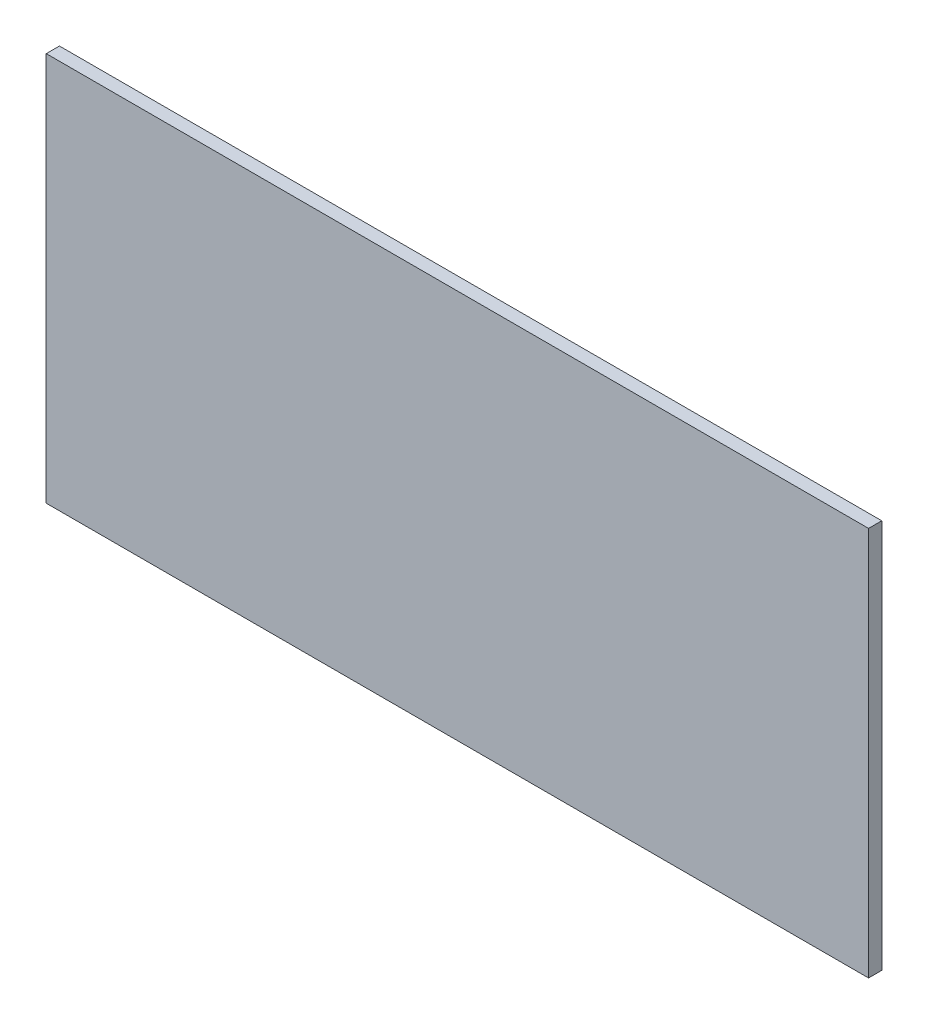
ISO-10303-21;
HEADER;
FILE_DESCRIPTION(('STEP AP214'),'2;1');
FILE_NAME('part.step','',(''),(''),'','','');
FILE_SCHEMA(('AUTOMOTIVE_DESIGN { 1 0 10303 214 1 1 1 1 }'));
ENDSEC;
DATA;
#1=APPLICATION_CONTEXT('core data for automotive mechanical design processes');
#2=APPLICATION_PROTOCOL_DEFINITION('international standard','automotive_design',2000,#1);
#3=PRODUCT_CONTEXT('',#1,'mechanical');
#4=PRODUCT('Part','Part','',(#3));
#5=PRODUCT_RELATED_PRODUCT_CATEGORY('part','',(#4));
#6=PRODUCT_DEFINITION_FORMATION('','',#4);
#7=PRODUCT_DEFINITION_CONTEXT('part definition',#1,'design');
#8=PRODUCT_DEFINITION('design','',#6,#7);
#9=PRODUCT_DEFINITION_SHAPE('','',#8);
#10=(LENGTH_UNIT() NAMED_UNIT(*) SI_UNIT(.MILLI.,.METRE.));
#11=(NAMED_UNIT(*) PLANE_ANGLE_UNIT() SI_UNIT($,.RADIAN.));
#12=(NAMED_UNIT(*) SI_UNIT($,.STERADIAN.) SOLID_ANGLE_UNIT());
#13=UNCERTAINTY_MEASURE_WITH_UNIT(LENGTH_MEASURE(1.E-05),#10,'distance_accuracy_value','');
#14=(GEOMETRIC_REPRESENTATION_CONTEXT(3) GLOBAL_UNCERTAINTY_ASSIGNED_CONTEXT((#13)) GLOBAL_UNIT_ASSIGNED_CONTEXT((#10,
#11,#12)) REPRESENTATION_CONTEXT('',''));
#15=CARTESIAN_POINT('',(0.,0.,0.));
#16=DIRECTION('',(0.,0.,1.));
#17=DIRECTION('',(1.,0.,0.));
#18=AXIS2_PLACEMENT_3D('',#15,#16,#17);
#19=CARTESIAN_POINT('',(-34.05,-14.75,1.));
#20=DIRECTION('',(1.,0.,0.));
#21=DIRECTION('',(0.,0.,-1.));
#22=AXIS2_PLACEMENT_3D('',#19,#20,#21);
#23=PLANE('',#22);
#24=DIRECTION('',(0.,-1.,0.));
#25=VECTOR('',#24,1.);
#26=CARTESIAN_POINT('',(-34.05,-14.75,0.));
#27=LINE('',#26,#25);
#28=CARTESIAN_POINT('',(-34.05,14.75,0.));
#29=VERTEX_POINT('',#28);
#30=CARTESIAN_POINT('',(-34.05,-14.75,0.));
#31=VERTEX_POINT('',#30);
#32=EDGE_CURVE('E98',#29,#31,#27,.T.);
#33=ORIENTED_EDGE('',*,*,#32,.T.);
#34=DIRECTION('',(0.,0.,-1.));
#35=VECTOR('',#34,1.);
#36=CARTESIAN_POINT('',(-34.05,-14.75,1.));
#37=LINE('',#36,#35);
#38=CARTESIAN_POINT('',(-34.05,-14.75,1.));
#39=VERTEX_POINT('',#38);
#40=EDGE_CURVE('E11',#39,#31,#37,.T.);
#41=ORIENTED_EDGE('',*,*,#40,.F.);
#42=DIRECTION('',(0.,-1.,0.));
#43=VECTOR('',#42,1.);
#44=CARTESIAN_POINT('',(-34.05,-14.75,1.));
#45=LINE('',#44,#43);
#46=CARTESIAN_POINT('',(-34.05,14.75,1.));
#47=VERTEX_POINT('',#46);
#48=EDGE_CURVE('E86',#47,#39,#45,.T.);
#49=ORIENTED_EDGE('',*,*,#48,.F.);
#50=DIRECTION('',(0.,0.,-1.));
#51=VECTOR('',#50,1.);
#52=CARTESIAN_POINT('',(-34.05,14.75,1.));
#53=LINE('',#52,#51);
#54=EDGE_CURVE('E94',#47,#29,#53,.T.);
#55=ORIENTED_EDGE('',*,*,#54,.T.);
#56=EDGE_LOOP('',(#33,#41,#49,#55));
#57=FACE_BOUND('',#56,.T.);
#58=ADVANCED_FACE('F35',(#57),#23,.F.);
#59=CARTESIAN_POINT('',(28.25,-14.75,1.));
#60=DIRECTION('',(0.,1.,0.));
#61=DIRECTION('',(-1.,0.,0.));
#62=AXIS2_PLACEMENT_3D('',#59,#60,#61);
#63=PLANE('',#62);
#64=DIRECTION('',(1.,0.,0.));
#65=VECTOR('',#64,1.);
#66=CARTESIAN_POINT('',(28.25,-14.75,0.));
#67=LINE('',#66,#65);
#68=CARTESIAN_POINT('',(28.25,-14.75,0.));
#69=VERTEX_POINT('',#68);
#70=EDGE_CURVE('E90',#31,#69,#67,.T.);
#71=ORIENTED_EDGE('',*,*,#70,.T.);
#72=DIRECTION('',(0.,0.,-1.));
#73=VECTOR('',#72,1.);
#74=CARTESIAN_POINT('',(28.25,-14.75,1.));
#75=LINE('',#74,#73);
#76=CARTESIAN_POINT('',(28.25,-14.75,1.));
#77=VERTEX_POINT('',#76);
#78=EDGE_CURVE('E43',#77,#69,#75,.T.);
#79=ORIENTED_EDGE('',*,*,#78,.F.);
#80=DIRECTION('',(1.,0.,0.));
#81=VECTOR('',#80,1.);
#82=CARTESIAN_POINT('',(28.25,-14.75,1.));
#83=LINE('',#82,#81);
#84=EDGE_CURVE('E81',#39,#77,#83,.T.);
#85=ORIENTED_EDGE('',*,*,#84,.F.);
#86=ORIENTED_EDGE('',*,*,#40,.T.);
#87=EDGE_LOOP('',(#71,#79,#85,#86));
#88=FACE_BOUND('',#87,.T.);
#89=ADVANCED_FACE('F89',(#88),#63,.F.);
#90=CARTESIAN_POINT('',(28.25,-14.75,1.));
#91=DIRECTION('',(-1.,0.,0.));
#92=DIRECTION('',(0.,0.,1.));
#93=AXIS2_PLACEMENT_3D('',#90,#91,#92);
#94=PLANE('',#93);
#95=DIRECTION('',(0.,1.,0.));
#96=VECTOR('',#95,1.);
#97=CARTESIAN_POINT('',(28.25,-14.75,0.));
#98=LINE('',#97,#96);
#99=CARTESIAN_POINT('',(28.25,14.75,0.));
#100=VERTEX_POINT('',#99);
#101=EDGE_CURVE('E68',#69,#100,#98,.T.);
#102=ORIENTED_EDGE('',*,*,#101,.T.);
#103=DIRECTION('',(0.,0.,-1.));
#104=VECTOR('',#103,1.);
#105=CARTESIAN_POINT('',(28.25,14.75,1.));
#106=LINE('',#105,#104);
#107=CARTESIAN_POINT('',(28.25,14.75,1.));
#108=VERTEX_POINT('',#107);
#109=EDGE_CURVE('E91',#108,#100,#106,.T.);
#110=ORIENTED_EDGE('',*,*,#109,.F.);
#111=DIRECTION('',(0.,1.,0.));
#112=VECTOR('',#111,1.);
#113=CARTESIAN_POINT('',(28.25,-14.75,1.));
#114=LINE('',#113,#112);
#115=EDGE_CURVE('E84',#77,#108,#114,.T.);
#116=ORIENTED_EDGE('',*,*,#115,.F.);
#117=ORIENTED_EDGE('',*,*,#78,.T.);
#118=EDGE_LOOP('',(#102,#110,#116,#117));
#119=FACE_BOUND('',#118,.T.);
#120=ADVANCED_FACE('F92',(#119),#94,.F.);
#121=CARTESIAN_POINT('',(28.25,14.75,1.));
#122=DIRECTION('',(0.,-1.,0.));
#123=DIRECTION('',(1.,0.,0.));
#124=AXIS2_PLACEMENT_3D('',#121,#122,#123);
#125=PLANE('',#124);
#126=DIRECTION('',(-1.,0.,0.));
#127=VECTOR('',#126,1.);
#128=CARTESIAN_POINT('',(28.25,14.75,0.));
#129=LINE('',#128,#127);
#130=EDGE_CURVE('E74',#100,#29,#129,.T.);
#131=ORIENTED_EDGE('',*,*,#130,.T.);
#132=ORIENTED_EDGE('',*,*,#54,.F.);
#133=DIRECTION('',(-1.,0.,0.));
#134=VECTOR('',#133,1.);
#135=CARTESIAN_POINT('',(28.25,14.75,1.));
#136=LINE('',#135,#134);
#137=EDGE_CURVE('E51',#108,#47,#136,.T.);
#138=ORIENTED_EDGE('',*,*,#137,.F.);
#139=ORIENTED_EDGE('',*,*,#109,.T.);
#140=EDGE_LOOP('',(#131,#132,#138,#139));
#141=FACE_BOUND('',#140,.T.);
#142=ADVANCED_FACE('F105',(#141),#125,.F.);
#143=CARTESIAN_POINT('',(0.,0.,1.));
#144=DIRECTION('',(0.,0.,1.));
#145=DIRECTION('',(1.,0.,0.));
#146=AXIS2_PLACEMENT_3D('',#143,#144,#145);
#147=PLANE('',#146);
#148=ORIENTED_EDGE('',*,*,#48,.T.);
#149=ORIENTED_EDGE('',*,*,#84,.T.);
#150=ORIENTED_EDGE('',*,*,#115,.T.);
#151=ORIENTED_EDGE('',*,*,#137,.T.);
#152=EDGE_LOOP('',(#148,#149,#150,#151));
#153=FACE_BOUND('',#152,.T.);
#154=ADVANCED_FACE('F82',(#153),#147,.T.);
#155=CARTESIAN_POINT('',(0.,0.,0.));
#156=DIRECTION('',(0.,0.,1.));
#157=DIRECTION('',(1.,0.,0.));
#158=AXIS2_PLACEMENT_3D('',#155,#156,#157);
#159=PLANE('',#158);
#160=ORIENTED_EDGE('',*,*,#32,.F.);
#161=ORIENTED_EDGE('',*,*,#130,.F.);
#162=ORIENTED_EDGE('',*,*,#101,.F.);
#163=ORIENTED_EDGE('',*,*,#70,.F.);
#164=EDGE_LOOP('',(#160,#161,#162,#163));
#165=FACE_BOUND('',#164,.T.);
#166=ADVANCED_FACE('F108',(#165),#159,.F.);
#167=CLOSED_SHELL('',(#58,#89,#120,#142,#154,#166));
#168=MANIFOLD_SOLID_BREP('B2',#167);
#169=ADVANCED_BREP_SHAPE_REPRESENTATION('',(#18,#168),#14);
#170=SHAPE_DEFINITION_REPRESENTATION(#9,#169);
ENDSEC;
END-ISO-10303-21;
